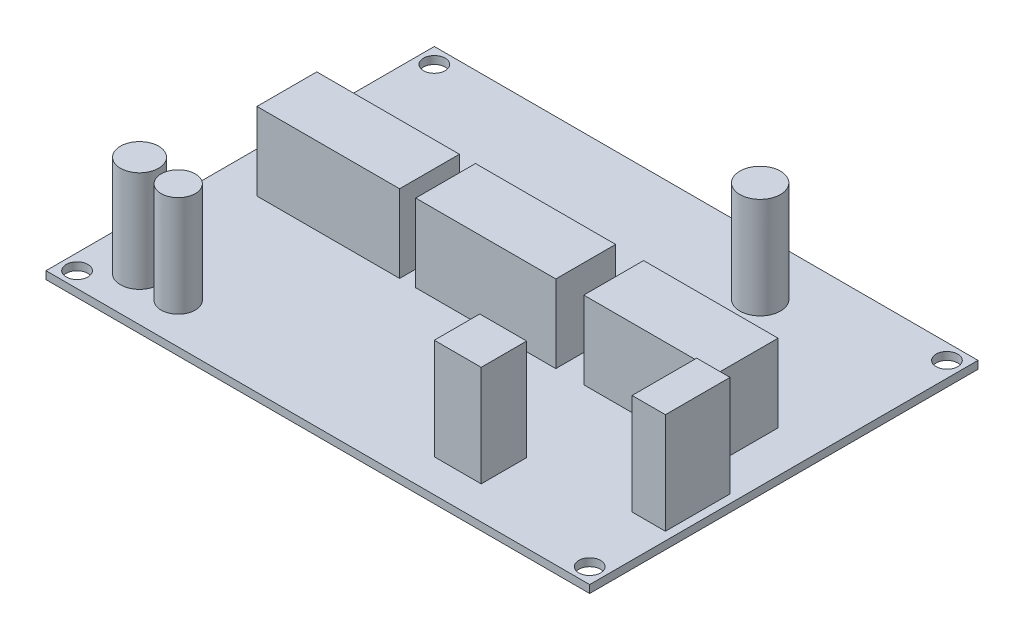
ISO-10303-21;
HEADER;
FILE_DESCRIPTION(('STEP AP214'),'2;1');
FILE_NAME('part.step','',(''),(''),'','','');
FILE_SCHEMA(('AUTOMOTIVE_DESIGN { 1 0 10303 214 1 1 1 1 }'));
ENDSEC;
DATA;
#1=APPLICATION_CONTEXT('core data for automotive mechanical design processes');
#2=APPLICATION_PROTOCOL_DEFINITION('international standard','automotive_design',2000,#1);
#3=PRODUCT_CONTEXT('',#1,'mechanical');
#4=PRODUCT('Part','Part','',(#3));
#5=PRODUCT_RELATED_PRODUCT_CATEGORY('part','',(#4));
#6=PRODUCT_DEFINITION_FORMATION('','',#4);
#7=PRODUCT_DEFINITION_CONTEXT('part definition',#1,'design');
#8=PRODUCT_DEFINITION('design','',#6,#7);
#9=PRODUCT_DEFINITION_SHAPE('','',#8);
#10=(LENGTH_UNIT() NAMED_UNIT(*) SI_UNIT(.MILLI.,.METRE.));
#11=(NAMED_UNIT(*) PLANE_ANGLE_UNIT() SI_UNIT($,.RADIAN.));
#12=(NAMED_UNIT(*) SI_UNIT($,.STERADIAN.) SOLID_ANGLE_UNIT());
#13=UNCERTAINTY_MEASURE_WITH_UNIT(LENGTH_MEASURE(1.E-05),#10,'distance_accuracy_value','');
#14=(GEOMETRIC_REPRESENTATION_CONTEXT(3) GLOBAL_UNCERTAINTY_ASSIGNED_CONTEXT((#13)) GLOBAL_UNIT_ASSIGNED_CONTEXT((#10,
#11,#12)) REPRESENTATION_CONTEXT('',''));
#15=CARTESIAN_POINT('',(0.,0.,0.));
#16=DIRECTION('',(0.,0.,1.));
#17=DIRECTION('',(1.,0.,0.));
#18=AXIS2_PLACEMENT_3D('',#15,#16,#17);
#19=CARTESIAN_POINT('',(0.,1.,0.));
#20=DIRECTION('',(0.,-1.,0.));
#21=DIRECTION('',(0.,0.,-1.));
#22=AXIS2_PLACEMENT_3D('',#19,#20,#21);
#23=PLANE('',#22);
#24=CARTESIAN_POINT('',(6.36727946623239,1.,-5.67661865059677));
#25=DIRECTION('',(0.,-1.,0.));
#26=DIRECTION('',(0.,0.,-1.));
#27=AXIS2_PLACEMENT_3D('',#24,#25,#26);
#28=CIRCLE('',#27,2.46146856132016);
#29=CARTESIAN_POINT('',(6.36727946623239,1.,-8.13808721191693));
#30=VERTEX_POINT('',#29);
#31=EDGE_CURVE('E11',#30,#30,#28,.F.);
#32=ORIENTED_EDGE('',*,*,#31,.F.);
#33=EDGE_LOOP('',(#32));
#34=FACE_BOUND('',#33,.T.);
#35=DIRECTION('',(0.,0.,1.));
#36=VECTOR('',#35,1.);
#37=CARTESIAN_POINT('',(45.7516822337425,1.,-4.24264186861123));
#38=LINE('',#37,#36);
#39=CARTESIAN_POINT('',(45.7516822337425,1.,-10.097866977997));
#40=VERTEX_POINT('',#39);
#41=CARTESIAN_POINT('',(45.7516822337425,1.,-4.24264186861123));
#42=VERTEX_POINT('',#41);
#43=EDGE_CURVE('E215',#40,#42,#38,.T.);
#44=ORIENTED_EDGE('',*,*,#43,.F.);
#45=DIRECTION('',(-1.,0.,0.));
#46=VECTOR('',#45,1.);
#47=CARTESIAN_POINT('',(45.7516822337425,1.,-10.097866977997));
#48=LINE('',#47,#46);
#49=CARTESIAN_POINT('',(51.7908402551996,1.,-10.097866977997));
#50=VERTEX_POINT('',#49);
#51=EDGE_CURVE('E228',#50,#40,#48,.T.);
#52=ORIENTED_EDGE('',*,*,#51,.F.);
#53=DIRECTION('',(0.,0.,-1.));
#54=VECTOR('',#53,1.);
#55=CARTESIAN_POINT('',(51.7908402551996,1.,-4.24264186861123));
#56=LINE('',#55,#54);
#57=CARTESIAN_POINT('',(51.7908402551996,1.,-4.24264186861123));
#58=VERTEX_POINT('',#57);
#59=EDGE_CURVE('E237',#58,#50,#56,.T.);
#60=ORIENTED_EDGE('',*,*,#59,.F.);
#61=DIRECTION('',(1.,0.,0.));
#62=VECTOR('',#61,1.);
#63=CARTESIAN_POINT('',(45.7516822337425,1.,-4.24264186861123));
#64=LINE('',#63,#62);
#65=EDGE_CURVE('E218',#42,#58,#64,.T.);
#66=ORIENTED_EDGE('',*,*,#65,.F.);
#67=EDGE_LOOP('',(#44,#52,#60,#66));
#68=FACE_BOUND('',#67,.T.);
#69=CARTESIAN_POINT('',(49.1775091770705,1.,-42.7745952635661));
#70=DIRECTION('',(0.,-1.,0.));
#71=DIRECTION('',(0.,0.,-1.));
#72=AXIS2_PLACEMENT_3D('',#69,#70,#71);
#73=CIRCLE('',#72,2.61333107812908);
#74=CARTESIAN_POINT('',(49.1775091770705,1.,-45.3879263416952));
#75=VERTEX_POINT('',#74);
#76=EDGE_CURVE('E41',#75,#75,#73,.F.);
#77=ORIENTED_EDGE('',*,*,#76,.F.);
#78=EDGE_LOOP('',(#77));
#79=FACE_BOUND('',#78,.T.);
#80=CARTESIAN_POINT('',(11.8124296488915,1.,-5.20728258898018));
#81=DIRECTION('',(0.,-1.,0.));
#82=DIRECTION('',(0.,0.,-1.));
#83=AXIS2_PLACEMENT_3D('',#80,#81,#82);
#84=CIRCLE('',#83,2.19939754507337);
#85=CARTESIAN_POINT('',(11.8124296488915,1.,-7.40668013405355));
#86=VERTEX_POINT('',#85);
#87=EDGE_CURVE('E412',#86,#86,#84,.F.);
#88=ORIENTED_EDGE('',*,*,#87,.F.);
#89=EDGE_LOOP('',(#88));
#90=FACE_BOUND('',#89,.T.);
#91=DIRECTION('',(0.,0.,1.));
#92=VECTOR('',#91,1.);
#93=CARTESIAN_POINT('',(25.7012497108633,1.,-21.8993989226632));
#94=LINE('',#93,#92);
#95=CARTESIAN_POINT('',(25.7012497108633,1.,-29.5999607452657));
#96=VERTEX_POINT('',#95);
#97=CARTESIAN_POINT('',(25.7012497108633,1.,-21.8993989226632));
#98=VERTEX_POINT('',#97);
#99=EDGE_CURVE('E292',#96,#98,#94,.T.);
#100=ORIENTED_EDGE('',*,*,#99,.F.);
#101=DIRECTION('',(-1.,0.,0.));
#102=VECTOR('',#101,1.);
#103=CARTESIAN_POINT('',(25.7012497108633,1.,-29.5999607452657));
#104=LINE('',#103,#102);
#105=CARTESIAN_POINT('',(43.7397057958719,1.,-29.5999607452657));
#106=VERTEX_POINT('',#105);
#107=EDGE_CURVE('E297',#106,#96,#104,.T.);
#108=ORIENTED_EDGE('',*,*,#107,.F.);
#109=DIRECTION('',(0.,0.,-1.));
#110=VECTOR('',#109,1.);
#111=CARTESIAN_POINT('',(43.7397057958719,1.,-21.8993989226632));
#112=LINE('',#111,#110);
#113=CARTESIAN_POINT('',(43.7397057958719,1.,-21.8993989226632));
#114=VERTEX_POINT('',#113);
#115=EDGE_CURVE('E309',#114,#106,#112,.T.);
#116=ORIENTED_EDGE('',*,*,#115,.F.);
#117=DIRECTION('',(1.,0.,0.));
#118=VECTOR('',#117,1.);
#119=CARTESIAN_POINT('',(25.7012497108633,1.,-21.8993989226632));
#120=LINE('',#119,#118);
#121=EDGE_CURVE('E306',#98,#114,#120,.T.);
#122=ORIENTED_EDGE('',*,*,#121,.F.);
#123=EDGE_LOOP('',(#100,#108,#116,#122));
#124=FACE_BOUND('',#123,.T.);
#125=DIRECTION('',(0.,0.,1.));
#126=VECTOR('',#125,1.);
#127=CARTESIAN_POINT('',(0.,1.,0.));
#128=LINE('',#127,#126);
#129=CARTESIAN_POINT('',(0.,1.,-50.));
#130=VERTEX_POINT('',#129);
#131=CARTESIAN_POINT('',(0.,1.,0.));
#132=VERTEX_POINT('',#131);
#133=EDGE_CURVE('E383',#130,#132,#128,.T.);
#134=ORIENTED_EDGE('',*,*,#133,.T.);
#135=DIRECTION('',(1.,0.,0.));
#136=VECTOR('',#135,1.);
#137=CARTESIAN_POINT('',(0.,1.,0.));
#138=LINE('',#137,#136);
#139=CARTESIAN_POINT('',(70.,1.,0.));
#140=VERTEX_POINT('',#139);
#141=EDGE_CURVE('E386',#132,#140,#138,.T.);
#142=ORIENTED_EDGE('',*,*,#141,.T.);
#143=DIRECTION('',(0.,0.,-1.));
#144=VECTOR('',#143,1.);
#145=CARTESIAN_POINT('',(70.,1.,0.));
#146=LINE('',#145,#144);
#147=CARTESIAN_POINT('',(70.,1.,-50.));
#148=VERTEX_POINT('',#147);
#149=EDGE_CURVE('E389',#140,#148,#146,.T.);
#150=ORIENTED_EDGE('',*,*,#149,.T.);
#151=DIRECTION('',(-1.,0.,0.));
#152=VECTOR('',#151,1.);
#153=CARTESIAN_POINT('',(0.,1.,-50.));
#154=LINE('',#153,#152);
#155=EDGE_CURVE('E391',#148,#130,#154,.T.);
#156=ORIENTED_EDGE('',*,*,#155,.T.);
#157=EDGE_LOOP('',(#134,#142,#150,#156));
#158=FACE_BOUND('',#157,.T.);
#159=CARTESIAN_POINT('',(2.00000000000002,1.,-48.));
#160=DIRECTION('',(0.,1.,0.));
#161=DIRECTION('',(0.,0.,1.));
#162=AXIS2_PLACEMENT_3D('',#159,#160,#161);
#163=CIRCLE('',#162,1.4);
#164=CARTESIAN_POINT('',(2.00000000000002,1.,-46.6));
#165=VERTEX_POINT('',#164);
#166=EDGE_CURVE('E362',#165,#165,#163,.T.);
#167=ORIENTED_EDGE('',*,*,#166,.F.);
#168=EDGE_LOOP('',(#167));
#169=FACE_BOUND('',#168,.T.);
#170=CARTESIAN_POINT('',(68.,1.,-48.));
#171=DIRECTION('',(0.,1.,0.));
#172=DIRECTION('',(0.,0.,1.));
#173=AXIS2_PLACEMENT_3D('',#170,#171,#172);
#174=CIRCLE('',#173,1.4);
#175=CARTESIAN_POINT('',(68.,1.,-46.6));
#176=VERTEX_POINT('',#175);
#177=EDGE_CURVE('E363',#176,#176,#174,.T.);
#178=ORIENTED_EDGE('',*,*,#177,.F.);
#179=EDGE_LOOP('',(#178));
#180=FACE_BOUND('',#179,.T.);
#181=CARTESIAN_POINT('',(68.,1.,-2.00000000000001));
#182=DIRECTION('',(0.,1.,0.));
#183=DIRECTION('',(0.,0.,1.));
#184=AXIS2_PLACEMENT_3D('',#181,#182,#183);
#185=CIRCLE('',#184,1.4);
#186=CARTESIAN_POINT('',(68.,1.,-0.600000000000006));
#187=VERTEX_POINT('',#186);
#188=EDGE_CURVE('E369',#187,#187,#185,.T.);
#189=ORIENTED_EDGE('',*,*,#188,.F.);
#190=EDGE_LOOP('',(#189));
#191=FACE_BOUND('',#190,.T.);
#192=CARTESIAN_POINT('',(2.00000000000001,1.,-2.00000000000001));
#193=DIRECTION('',(0.,1.,0.));
#194=DIRECTION('',(0.,0.,1.));
#195=AXIS2_PLACEMENT_3D('',#192,#193,#194);
#196=CIRCLE('',#195,1.4);
#197=CARTESIAN_POINT('',(2.00000000000001,1.,-0.600000000000009));
#198=VERTEX_POINT('',#197);
#199=EDGE_CURVE('E358',#198,#198,#196,.T.);
#200=ORIENTED_EDGE('',*,*,#199,.F.);
#201=EDGE_LOOP('',(#200));
#202=FACE_BOUND('',#201,.T.);
#203=DIRECTION('',(0.,0.,1.));
#204=VECTOR('',#203,1.);
#205=CARTESIAN_POINT('',(5.26435120326596,1.,-21.8993989226632));
#206=LINE('',#205,#204);
#207=CARTESIAN_POINT('',(5.26435120326596,1.,-29.5999607452657));
#208=VERTEX_POINT('',#207);
#209=CARTESIAN_POINT('',(5.26435120326596,1.,-21.8993989226632));
#210=VERTEX_POINT('',#209);
#211=EDGE_CURVE('E325',#208,#210,#206,.T.);
#212=ORIENTED_EDGE('',*,*,#211,.F.);
#213=DIRECTION('',(-1.,0.,0.));
#214=VECTOR('',#213,1.);
#215=CARTESIAN_POINT('',(5.26435120326596,1.,-29.5999607452657));
#216=LINE('',#215,#214);
#217=CARTESIAN_POINT('',(23.6300542942445,1.,-29.5999607452657));
#218=VERTEX_POINT('',#217);
#219=EDGE_CURVE('E330',#218,#208,#216,.T.);
#220=ORIENTED_EDGE('',*,*,#219,.F.);
#221=DIRECTION('',(0.,0.,-1.));
#222=VECTOR('',#221,1.);
#223=CARTESIAN_POINT('',(23.6300542942445,1.,-21.8993989226632));
#224=LINE('',#223,#222);
#225=CARTESIAN_POINT('',(23.6300542942445,1.,-21.8993989226632));
#226=VERTEX_POINT('',#225);
#227=EDGE_CURVE('E342',#226,#218,#224,.T.);
#228=ORIENTED_EDGE('',*,*,#227,.F.);
#229=DIRECTION('',(1.,0.,0.));
#230=VECTOR('',#229,1.);
#231=CARTESIAN_POINT('',(5.26435120326596,1.,-21.8993989226632));
#232=LINE('',#231,#230);
#233=EDGE_CURVE('E339',#210,#226,#232,.T.);
#234=ORIENTED_EDGE('',*,*,#233,.F.);
#235=EDGE_LOOP('',(#212,#220,#228,#234));
#236=FACE_BOUND('',#235,.T.);
#237=DIRECTION('',(0.,0.,1.));
#238=VECTOR('',#237,1.);
#239=CARTESIAN_POINT('',(47.3437497293787,1.,-21.8993989226632));
#240=LINE('',#239,#238);
#241=CARTESIAN_POINT('',(47.3437497293787,1.,-29.5999607452657));
#242=VERTEX_POINT('',#241);
#243=CARTESIAN_POINT('',(47.3437497293787,1.,-21.8993989226632));
#244=VERTEX_POINT('',#243);
#245=EDGE_CURVE('E259',#242,#244,#240,.T.);
#246=ORIENTED_EDGE('',*,*,#245,.F.);
#247=DIRECTION('',(-1.,0.,0.));
#248=VECTOR('',#247,1.);
#249=CARTESIAN_POINT('',(47.3437497293787,1.,-29.5999607452657));
#250=LINE('',#249,#248);
#251=CARTESIAN_POINT('',(64.6577057434001,1.,-29.5999607452657));
#252=VERTEX_POINT('',#251);
#253=EDGE_CURVE('E264',#252,#242,#250,.T.);
#254=ORIENTED_EDGE('',*,*,#253,.F.);
#255=DIRECTION('',(0.,0.,-1.));
#256=VECTOR('',#255,1.);
#257=CARTESIAN_POINT('',(64.6577057434001,1.,-21.8993989226632));
#258=LINE('',#257,#256);
#259=CARTESIAN_POINT('',(64.6577057434001,1.,-21.8993989226632));
#260=VERTEX_POINT('',#259);
#261=EDGE_CURVE('E276',#260,#252,#258,.T.);
#262=ORIENTED_EDGE('',*,*,#261,.F.);
#263=DIRECTION('',(1.,0.,0.));
#264=VECTOR('',#263,1.);
#265=CARTESIAN_POINT('',(47.3437497293787,1.,-21.8993989226632));
#266=LINE('',#265,#264);
#267=EDGE_CURVE('E273',#244,#260,#266,.T.);
#268=ORIENTED_EDGE('',*,*,#267,.F.);
#269=EDGE_LOOP('',(#246,#254,#262,#268));
#270=FACE_BOUND('',#269,.T.);
#271=DIRECTION('',(0.,0.,-1.));
#272=VECTOR('',#271,1.);
#273=CARTESIAN_POINT('',(68.9340442963626,1.,-10.8187442746299));
#274=LINE('',#273,#272);
#275=CARTESIAN_POINT('',(68.9340442963626,1.,-10.8187442746299));
#276=VERTEX_POINT('',#275);
#277=CARTESIAN_POINT('',(68.9340442963626,1.,-19.1394672708221));
#278=VERTEX_POINT('',#277);
#279=EDGE_CURVE('E214',#276,#278,#274,.T.);
#280=ORIENTED_EDGE('',*,*,#279,.F.);
#281=DIRECTION('',(1.,0.,0.));
#282=VECTOR('',#281,1.);
#283=CARTESIAN_POINT('',(68.9340442963626,1.,-10.8187442746299));
#284=LINE('',#283,#282);
#285=CARTESIAN_POINT('',(64.6456574352001,1.,-10.8187442746299));
#286=VERTEX_POINT('',#285);
#287=EDGE_CURVE('E211',#286,#276,#284,.T.);
#288=ORIENTED_EDGE('',*,*,#287,.F.);
#289=DIRECTION('',(0.,0.,1.));
#290=VECTOR('',#289,1.);
#291=CARTESIAN_POINT('',(64.6456574352001,1.,-10.8187442746299));
#292=LINE('',#291,#290);
#293=CARTESIAN_POINT('',(64.6456574352001,1.,-19.1394672708221));
#294=VERTEX_POINT('',#293);
#295=EDGE_CURVE('E53',#294,#286,#292,.T.);
#296=ORIENTED_EDGE('',*,*,#295,.F.);
#297=DIRECTION('',(-1.,0.,0.));
#298=VECTOR('',#297,1.);
#299=CARTESIAN_POINT('',(68.9340442963626,1.,-19.1394672708221));
#300=LINE('',#299,#298);
#301=EDGE_CURVE('E48',#278,#294,#300,.T.);
#302=ORIENTED_EDGE('',*,*,#301,.F.);
#303=EDGE_LOOP('',(#280,#288,#296,#302));
#304=FACE_BOUND('',#303,.T.);
#305=ADVANCED_FACE('F33',(#34,#68,#79,#90,#124,#158,#169,#180,#191,#202,#236,#270,#304),#23,.F.);
#306=CARTESIAN_POINT('',(0.,1.,0.));
#307=DIRECTION('',(1.,0.,0.));
#308=DIRECTION('',(0.,0.,-1.));
#309=AXIS2_PLACEMENT_3D('',#306,#307,#308);
#310=PLANE('',#309);
#311=DIRECTION('',(0.,0.,1.));
#312=VECTOR('',#311,1.);
#313=CARTESIAN_POINT('',(0.,0.,0.));
#314=LINE('',#313,#312);
#315=CARTESIAN_POINT('',(0.,0.,-50.));
#316=VERTEX_POINT('',#315);
#317=CARTESIAN_POINT('',(0.,0.,0.));
#318=VERTEX_POINT('',#317);
#319=EDGE_CURVE('E380',#316,#318,#314,.T.);
#320=ORIENTED_EDGE('',*,*,#319,.T.);
#321=DIRECTION('',(0.,-1.,0.));
#322=VECTOR('',#321,1.);
#323=CARTESIAN_POINT('',(0.,1.,0.));
#324=LINE('',#323,#322);
#325=EDGE_CURVE('E409',#132,#318,#324,.T.);
#326=ORIENTED_EDGE('',*,*,#325,.F.);
#327=ORIENTED_EDGE('',*,*,#133,.F.);
#328=DIRECTION('',(0.,-1.,0.));
#329=VECTOR('',#328,1.);
#330=CARTESIAN_POINT('',(0.,1.,-50.));
#331=LINE('',#330,#329);
#332=EDGE_CURVE('E393',#130,#316,#331,.T.);
#333=ORIENTED_EDGE('',*,*,#332,.T.);
#334=EDGE_LOOP('',(#320,#326,#327,#333));
#335=FACE_BOUND('',#334,.T.);
#336=ADVANCED_FACE('F35',(#335),#310,.F.);
#337=CARTESIAN_POINT('',(0.,1.,0.));
#338=DIRECTION('',(0.,0.,-1.));
#339=DIRECTION('',(-1.,0.,0.));
#340=AXIS2_PLACEMENT_3D('',#337,#338,#339);
#341=PLANE('',#340);
#342=DIRECTION('',(1.,0.,0.));
#343=VECTOR('',#342,1.);
#344=CARTESIAN_POINT('',(0.,0.,0.));
#345=LINE('',#344,#343);
#346=CARTESIAN_POINT('',(70.,0.,0.));
#347=VERTEX_POINT('',#346);
#348=EDGE_CURVE('E396',#318,#347,#345,.T.);
#349=ORIENTED_EDGE('',*,*,#348,.T.);
#350=DIRECTION('',(0.,-1.,0.));
#351=VECTOR('',#350,1.);
#352=CARTESIAN_POINT('',(70.,1.,0.));
#353=LINE('',#352,#351);
#354=EDGE_CURVE('E406',#140,#347,#353,.T.);
#355=ORIENTED_EDGE('',*,*,#354,.F.);
#356=ORIENTED_EDGE('',*,*,#141,.F.);
#357=ORIENTED_EDGE('',*,*,#325,.T.);
#358=EDGE_LOOP('',(#349,#355,#356,#357));
#359=FACE_BOUND('',#358,.T.);
#360=ADVANCED_FACE('F592',(#359),#341,.F.);
#361=CARTESIAN_POINT('',(70.,1.,0.));
#362=DIRECTION('',(-1.,0.,0.));
#363=DIRECTION('',(0.,0.,1.));
#364=AXIS2_PLACEMENT_3D('',#361,#362,#363);
#365=PLANE('',#364);
#366=DIRECTION('',(0.,0.,-1.));
#367=VECTOR('',#366,1.);
#368=CARTESIAN_POINT('',(70.,0.,0.));
#369=LINE('',#368,#367);
#370=CARTESIAN_POINT('',(70.,0.,-50.));
#371=VERTEX_POINT('',#370);
#372=EDGE_CURVE('E398',#347,#371,#369,.T.);
#373=ORIENTED_EDGE('',*,*,#372,.T.);
#374=DIRECTION('',(0.,-1.,0.));
#375=VECTOR('',#374,1.);
#376=CARTESIAN_POINT('',(70.,1.,-50.));
#377=LINE('',#376,#375);
#378=EDGE_CURVE('E403',#148,#371,#377,.T.);
#379=ORIENTED_EDGE('',*,*,#378,.F.);
#380=ORIENTED_EDGE('',*,*,#149,.F.);
#381=ORIENTED_EDGE('',*,*,#354,.T.);
#382=EDGE_LOOP('',(#373,#379,#380,#381));
#383=FACE_BOUND('',#382,.T.);
#384=ADVANCED_FACE('F589',(#383),#365,.F.);
#385=CARTESIAN_POINT('',(0.,1.,-50.));
#386=DIRECTION('',(0.,0.,1.));
#387=DIRECTION('',(1.,0.,0.));
#388=AXIS2_PLACEMENT_3D('',#385,#386,#387);
#389=PLANE('',#388);
#390=DIRECTION('',(-1.,0.,0.));
#391=VECTOR('',#390,1.);
#392=CARTESIAN_POINT('',(0.,0.,-50.));
#393=LINE('',#392,#391);
#394=EDGE_CURVE('E387',#371,#316,#393,.T.);
#395=ORIENTED_EDGE('',*,*,#394,.T.);
#396=ORIENTED_EDGE('',*,*,#332,.F.);
#397=ORIENTED_EDGE('',*,*,#155,.F.);
#398=ORIENTED_EDGE('',*,*,#378,.T.);
#399=EDGE_LOOP('',(#395,#396,#397,#398));
#400=FACE_BOUND('',#399,.T.);
#401=ADVANCED_FACE('F585',(#400),#389,.F.);
#402=CARTESIAN_POINT('',(0.,0.,0.));
#403=DIRECTION('',(0.,-1.,0.));
#404=DIRECTION('',(0.,0.,-1.));
#405=AXIS2_PLACEMENT_3D('',#402,#403,#404);
#406=PLANE('',#405);
#407=CARTESIAN_POINT('',(2.00000000000001,0.,-2.00000000000001));
#408=DIRECTION('',(0.,1.,0.));
#409=DIRECTION('',(0.,0.,1.));
#410=AXIS2_PLACEMENT_3D('',#407,#408,#409);
#411=CIRCLE('',#410,1.4);
#412=CARTESIAN_POINT('',(2.00000000000001,0.,-0.600000000000009));
#413=VERTEX_POINT('',#412);
#414=EDGE_CURVE('E372',#413,#413,#411,.T.);
#415=ORIENTED_EDGE('',*,*,#414,.T.);
#416=EDGE_LOOP('',(#415));
#417=FACE_BOUND('',#416,.T.);
#418=CARTESIAN_POINT('',(68.,0.,-2.00000000000001));
#419=DIRECTION('',(0.,1.,0.));
#420=DIRECTION('',(0.,0.,1.));
#421=AXIS2_PLACEMENT_3D('',#418,#419,#420);
#422=CIRCLE('',#421,1.4);
#423=CARTESIAN_POINT('',(68.,0.,-0.600000000000006));
#424=VERTEX_POINT('',#423);
#425=EDGE_CURVE('E366',#424,#424,#422,.T.);
#426=ORIENTED_EDGE('',*,*,#425,.T.);
#427=EDGE_LOOP('',(#426));
#428=FACE_BOUND('',#427,.T.);
#429=CARTESIAN_POINT('',(68.,0.,-48.));
#430=DIRECTION('',(0.,1.,0.));
#431=DIRECTION('',(0.,0.,1.));
#432=AXIS2_PLACEMENT_3D('',#429,#430,#431);
#433=CIRCLE('',#432,1.4);
#434=CARTESIAN_POINT('',(68.,0.,-46.6));
#435=VERTEX_POINT('',#434);
#436=EDGE_CURVE('E359',#435,#435,#433,.T.);
#437=ORIENTED_EDGE('',*,*,#436,.T.);
#438=EDGE_LOOP('',(#437));
#439=FACE_BOUND('',#438,.T.);
#440=CARTESIAN_POINT('',(2.00000000000002,0.,-48.));
#441=DIRECTION('',(0.,1.,0.));
#442=DIRECTION('',(0.,0.,1.));
#443=AXIS2_PLACEMENT_3D('',#440,#441,#442);
#444=CIRCLE('',#443,1.4);
#445=CARTESIAN_POINT('',(2.00000000000002,0.,-46.6));
#446=VERTEX_POINT('',#445);
#447=EDGE_CURVE('E377',#446,#446,#444,.T.);
#448=ORIENTED_EDGE('',*,*,#447,.T.);
#449=EDGE_LOOP('',(#448));
#450=FACE_BOUND('',#449,.T.);
#451=ORIENTED_EDGE('',*,*,#319,.F.);
#452=ORIENTED_EDGE('',*,*,#394,.F.);
#453=ORIENTED_EDGE('',*,*,#372,.F.);
#454=ORIENTED_EDGE('',*,*,#348,.F.);
#455=EDGE_LOOP('',(#451,#452,#453,#454));
#456=FACE_BOUND('',#455,.T.);
#457=ADVANCED_FACE('F580',(#417,#428,#439,#450,#456),#406,.T.);
#458=CARTESIAN_POINT('',(2.00000000000002,0.,-48.));
#459=DIRECTION('',(0.,1.,0.));
#460=DIRECTION('',(0.,0.,1.));
#461=AXIS2_PLACEMENT_3D('',#458,#459,#460);
#462=CYLINDRICAL_SURFACE('',#461,1.4);
#463=ORIENTED_EDGE('',*,*,#447,.F.);
#464=EDGE_LOOP('',(#463));
#465=FACE_BOUND('',#464,.T.);
#466=ORIENTED_EDGE('',*,*,#166,.T.);
#467=EDGE_LOOP('',(#466));
#468=FACE_BOUND('',#467,.T.);
#469=ADVANCED_FACE('F571',(#465,#468),#462,.F.);
#470=CARTESIAN_POINT('',(68.,0.,-48.));
#471=DIRECTION('',(0.,1.,0.));
#472=DIRECTION('',(0.,0.,1.));
#473=AXIS2_PLACEMENT_3D('',#470,#471,#472);
#474=CYLINDRICAL_SURFACE('',#473,1.4);
#475=ORIENTED_EDGE('',*,*,#436,.F.);
#476=EDGE_LOOP('',(#475));
#477=FACE_BOUND('',#476,.T.);
#478=ORIENTED_EDGE('',*,*,#177,.T.);
#479=EDGE_LOOP('',(#478));
#480=FACE_BOUND('',#479,.T.);
#481=ADVANCED_FACE('F567',(#477,#480),#474,.F.);
#482=CARTESIAN_POINT('',(68.,0.,-2.00000000000001));
#483=DIRECTION('',(0.,1.,0.));
#484=DIRECTION('',(0.,0.,1.));
#485=AXIS2_PLACEMENT_3D('',#482,#483,#484);
#486=CYLINDRICAL_SURFACE('',#485,1.4);
#487=ORIENTED_EDGE('',*,*,#425,.F.);
#488=EDGE_LOOP('',(#487));
#489=FACE_BOUND('',#488,.T.);
#490=ORIENTED_EDGE('',*,*,#188,.T.);
#491=EDGE_LOOP('',(#490));
#492=FACE_BOUND('',#491,.T.);
#493=ADVANCED_FACE('F570',(#489,#492),#486,.F.);
#494=CARTESIAN_POINT('',(2.00000000000001,0.,-2.00000000000001));
#495=DIRECTION('',(0.,1.,0.));
#496=DIRECTION('',(0.,0.,1.));
#497=AXIS2_PLACEMENT_3D('',#494,#495,#496);
#498=CYLINDRICAL_SURFACE('',#497,1.4);
#499=ORIENTED_EDGE('',*,*,#414,.F.);
#500=EDGE_LOOP('',(#499));
#501=FACE_BOUND('',#500,.T.);
#502=ORIENTED_EDGE('',*,*,#199,.T.);
#503=EDGE_LOOP('',(#502));
#504=FACE_BOUND('',#503,.T.);
#505=ADVANCED_FACE('F565',(#501,#504),#498,.F.);
#506=CARTESIAN_POINT('',(5.26435120326596,11.,-21.8993989226632));
#507=DIRECTION('',(1.,0.,0.));
#508=DIRECTION('',(0.,0.,-1.));
#509=AXIS2_PLACEMENT_3D('',#506,#507,#508);
#510=PLANE('',#509);
#511=ORIENTED_EDGE('',*,*,#211,.T.);
#512=DIRECTION('',(0.,-1.,0.));
#513=VECTOR('',#512,1.);
#514=CARTESIAN_POINT('',(5.26435120326596,11.,-21.8993989226632));
#515=LINE('',#514,#513);
#516=CARTESIAN_POINT('',(5.26435120326596,11.,-21.8993989226632));
#517=VERTEX_POINT('',#516);
#518=EDGE_CURVE('E355',#517,#210,#515,.T.);
#519=ORIENTED_EDGE('',*,*,#518,.F.);
#520=DIRECTION('',(0.,0.,1.));
#521=VECTOR('',#520,1.);
#522=CARTESIAN_POINT('',(5.26435120326596,11.,-21.8993989226632));
#523=LINE('',#522,#521);
#524=CARTESIAN_POINT('',(5.26435120326596,11.,-29.5999607452657));
#525=VERTEX_POINT('',#524);
#526=EDGE_CURVE('E326',#525,#517,#523,.T.);
#527=ORIENTED_EDGE('',*,*,#526,.F.);
#528=DIRECTION('',(0.,-1.,0.));
#529=VECTOR('',#528,1.);
#530=CARTESIAN_POINT('',(5.26435120326596,11.,-29.5999607452657));
#531=LINE('',#530,#529);
#532=EDGE_CURVE('E336',#525,#208,#531,.T.);
#533=ORIENTED_EDGE('',*,*,#532,.T.);
#534=EDGE_LOOP('',(#511,#519,#527,#533));
#535=FACE_BOUND('',#534,.T.);
#536=ADVANCED_FACE('F561',(#535),#510,.F.);
#537=CARTESIAN_POINT('',(5.26435120326596,11.,-21.8993989226632));
#538=DIRECTION('',(0.,0.,-1.));
#539=DIRECTION('',(-1.,0.,0.));
#540=AXIS2_PLACEMENT_3D('',#537,#538,#539);
#541=PLANE('',#540);
#542=ORIENTED_EDGE('',*,*,#233,.T.);
#543=DIRECTION('',(0.,-1.,0.));
#544=VECTOR('',#543,1.);
#545=CARTESIAN_POINT('',(23.6300542942445,11.,-21.8993989226632));
#546=LINE('',#545,#544);
#547=CARTESIAN_POINT('',(23.6300542942445,11.,-21.8993989226632));
#548=VERTEX_POINT('',#547);
#549=EDGE_CURVE('E352',#548,#226,#546,.T.);
#550=ORIENTED_EDGE('',*,*,#549,.F.);
#551=DIRECTION('',(1.,0.,0.));
#552=VECTOR('',#551,1.);
#553=CARTESIAN_POINT('',(5.26435120326596,11.,-21.8993989226632));
#554=LINE('',#553,#552);
#555=EDGE_CURVE('E329',#517,#548,#554,.T.);
#556=ORIENTED_EDGE('',*,*,#555,.F.);
#557=ORIENTED_EDGE('',*,*,#518,.T.);
#558=EDGE_LOOP('',(#542,#550,#556,#557));
#559=FACE_BOUND('',#558,.T.);
#560=ADVANCED_FACE('F557',(#559),#541,.F.);
#561=CARTESIAN_POINT('',(23.6300542942445,11.,-21.8993989226632));
#562=DIRECTION('',(-1.,0.,0.));
#563=DIRECTION('',(0.,0.,1.));
#564=AXIS2_PLACEMENT_3D('',#561,#562,#563);
#565=PLANE('',#564);
#566=ORIENTED_EDGE('',*,*,#227,.T.);
#567=DIRECTION('',(0.,-1.,0.));
#568=VECTOR('',#567,1.);
#569=CARTESIAN_POINT('',(23.6300542942445,11.,-29.5999607452657));
#570=LINE('',#569,#568);
#571=CARTESIAN_POINT('',(23.6300542942445,11.,-29.5999607452657));
#572=VERTEX_POINT('',#571);
#573=EDGE_CURVE('E349',#572,#218,#570,.T.);
#574=ORIENTED_EDGE('',*,*,#573,.F.);
#575=DIRECTION('',(0.,0.,-1.));
#576=VECTOR('',#575,1.);
#577=CARTESIAN_POINT('',(23.6300542942445,11.,-21.8993989226632));
#578=LINE('',#577,#576);
#579=EDGE_CURVE('E332',#548,#572,#578,.T.);
#580=ORIENTED_EDGE('',*,*,#579,.F.);
#581=ORIENTED_EDGE('',*,*,#549,.T.);
#582=EDGE_LOOP('',(#566,#574,#580,#581));
#583=FACE_BOUND('',#582,.T.);
#584=ADVANCED_FACE('F553',(#583),#565,.F.);
#585=CARTESIAN_POINT('',(5.26435120326596,11.,-29.5999607452657));
#586=DIRECTION('',(0.,0.,1.));
#587=DIRECTION('',(1.,0.,0.));
#588=AXIS2_PLACEMENT_3D('',#585,#586,#587);
#589=PLANE('',#588);
#590=ORIENTED_EDGE('',*,*,#219,.T.);
#591=ORIENTED_EDGE('',*,*,#532,.F.);
#592=DIRECTION('',(-1.,0.,0.));
#593=VECTOR('',#592,1.);
#594=CARTESIAN_POINT('',(5.26435120326596,11.,-29.5999607452657));
#595=LINE('',#594,#593);
#596=EDGE_CURVE('E334',#572,#525,#595,.T.);
#597=ORIENTED_EDGE('',*,*,#596,.F.);
#598=ORIENTED_EDGE('',*,*,#573,.T.);
#599=EDGE_LOOP('',(#590,#591,#597,#598));
#600=FACE_BOUND('',#599,.T.);
#601=ADVANCED_FACE('F549',(#600),#589,.F.);
#602=CARTESIAN_POINT('',(0.,11.,0.));
#603=DIRECTION('',(0.,-1.,0.));
#604=DIRECTION('',(0.,0.,-1.));
#605=AXIS2_PLACEMENT_3D('',#602,#603,#604);
#606=PLANE('',#605);
#607=ORIENTED_EDGE('',*,*,#526,.T.);
#608=ORIENTED_EDGE('',*,*,#555,.T.);
#609=ORIENTED_EDGE('',*,*,#579,.T.);
#610=ORIENTED_EDGE('',*,*,#596,.T.);
#611=EDGE_LOOP('',(#607,#608,#609,#610));
#612=FACE_BOUND('',#611,.T.);
#613=ADVANCED_FACE('F545',(#612),#606,.F.);
#614=CARTESIAN_POINT('',(25.7012497108633,11.,-21.8993989226632));
#615=DIRECTION('',(1.,0.,0.));
#616=DIRECTION('',(0.,0.,-1.));
#617=AXIS2_PLACEMENT_3D('',#614,#615,#616);
#618=PLANE('',#617);
#619=ORIENTED_EDGE('',*,*,#99,.T.);
#620=DIRECTION('',(0.,-1.,0.));
#621=VECTOR('',#620,1.);
#622=CARTESIAN_POINT('',(25.7012497108633,11.,-21.8993989226632));
#623=LINE('',#622,#621);
#624=CARTESIAN_POINT('',(25.7012497108633,11.,-21.8993989226632));
#625=VERTEX_POINT('',#624);
#626=EDGE_CURVE('E322',#625,#98,#623,.T.);
#627=ORIENTED_EDGE('',*,*,#626,.F.);
#628=DIRECTION('',(0.,0.,1.));
#629=VECTOR('',#628,1.);
#630=CARTESIAN_POINT('',(25.7012497108633,11.,-21.8993989226632));
#631=LINE('',#630,#629);
#632=CARTESIAN_POINT('',(25.7012497108633,11.,-29.5999607452657));
#633=VERTEX_POINT('',#632);
#634=EDGE_CURVE('E293',#633,#625,#631,.T.);
#635=ORIENTED_EDGE('',*,*,#634,.F.);
#636=DIRECTION('',(0.,-1.,0.));
#637=VECTOR('',#636,1.);
#638=CARTESIAN_POINT('',(25.7012497108633,11.,-29.5999607452657));
#639=LINE('',#638,#637);
#640=EDGE_CURVE('E303',#633,#96,#639,.T.);
#641=ORIENTED_EDGE('',*,*,#640,.T.);
#642=EDGE_LOOP('',(#619,#627,#635,#641));
#643=FACE_BOUND('',#642,.T.);
#644=ADVANCED_FACE('F541',(#643),#618,.F.);
#645=CARTESIAN_POINT('',(25.7012497108633,11.,-21.8993989226632));
#646=DIRECTION('',(0.,0.,-1.));
#647=DIRECTION('',(-1.,0.,0.));
#648=AXIS2_PLACEMENT_3D('',#645,#646,#647);
#649=PLANE('',#648);
#650=ORIENTED_EDGE('',*,*,#121,.T.);
#651=DIRECTION('',(0.,-1.,0.));
#652=VECTOR('',#651,1.);
#653=CARTESIAN_POINT('',(43.7397057958719,11.,-21.8993989226632));
#654=LINE('',#653,#652);
#655=CARTESIAN_POINT('',(43.7397057958719,11.,-21.8993989226632));
#656=VERTEX_POINT('',#655);
#657=EDGE_CURVE('E319',#656,#114,#654,.T.);
#658=ORIENTED_EDGE('',*,*,#657,.F.);
#659=DIRECTION('',(1.,0.,0.));
#660=VECTOR('',#659,1.);
#661=CARTESIAN_POINT('',(25.7012497108633,11.,-21.8993989226632));
#662=LINE('',#661,#660);
#663=EDGE_CURVE('E296',#625,#656,#662,.T.);
#664=ORIENTED_EDGE('',*,*,#663,.F.);
#665=ORIENTED_EDGE('',*,*,#626,.T.);
#666=EDGE_LOOP('',(#650,#658,#664,#665));
#667=FACE_BOUND('',#666,.T.);
#668=ADVANCED_FACE('F537',(#667),#649,.F.);
#669=CARTESIAN_POINT('',(43.7397057958719,11.,-21.8993989226632));
#670=DIRECTION('',(-1.,0.,0.));
#671=DIRECTION('',(0.,0.,1.));
#672=AXIS2_PLACEMENT_3D('',#669,#670,#671);
#673=PLANE('',#672);
#674=ORIENTED_EDGE('',*,*,#115,.T.);
#675=DIRECTION('',(0.,-1.,0.));
#676=VECTOR('',#675,1.);
#677=CARTESIAN_POINT('',(43.7397057958719,11.,-29.5999607452657));
#678=LINE('',#677,#676);
#679=CARTESIAN_POINT('',(43.7397057958719,11.,-29.5999607452657));
#680=VERTEX_POINT('',#679);
#681=EDGE_CURVE('E316',#680,#106,#678,.T.);
#682=ORIENTED_EDGE('',*,*,#681,.F.);
#683=DIRECTION('',(0.,0.,-1.));
#684=VECTOR('',#683,1.);
#685=CARTESIAN_POINT('',(43.7397057958719,11.,-21.8993989226632));
#686=LINE('',#685,#684);
#687=EDGE_CURVE('E299',#656,#680,#686,.T.);
#688=ORIENTED_EDGE('',*,*,#687,.F.);
#689=ORIENTED_EDGE('',*,*,#657,.T.);
#690=EDGE_LOOP('',(#674,#682,#688,#689));
#691=FACE_BOUND('',#690,.T.);
#692=ADVANCED_FACE('F533',(#691),#673,.F.);
#693=CARTESIAN_POINT('',(25.7012497108633,11.,-29.5999607452657));
#694=DIRECTION('',(0.,0.,1.));
#695=DIRECTION('',(1.,0.,0.));
#696=AXIS2_PLACEMENT_3D('',#693,#694,#695);
#697=PLANE('',#696);
#698=ORIENTED_EDGE('',*,*,#107,.T.);
#699=ORIENTED_EDGE('',*,*,#640,.F.);
#700=DIRECTION('',(-1.,0.,0.));
#701=VECTOR('',#700,1.);
#702=CARTESIAN_POINT('',(25.7012497108633,11.,-29.5999607452657));
#703=LINE('',#702,#701);
#704=EDGE_CURVE('E301',#680,#633,#703,.T.);
#705=ORIENTED_EDGE('',*,*,#704,.F.);
#706=ORIENTED_EDGE('',*,*,#681,.T.);
#707=EDGE_LOOP('',(#698,#699,#705,#706));
#708=FACE_BOUND('',#707,.T.);
#709=ADVANCED_FACE('F529',(#708),#697,.F.);
#710=CARTESIAN_POINT('',(0.,11.,0.));
#711=DIRECTION('',(0.,-1.,0.));
#712=DIRECTION('',(0.,0.,-1.));
#713=AXIS2_PLACEMENT_3D('',#710,#711,#712);
#714=PLANE('',#713);
#715=ORIENTED_EDGE('',*,*,#634,.T.);
#716=ORIENTED_EDGE('',*,*,#663,.T.);
#717=ORIENTED_EDGE('',*,*,#687,.T.);
#718=ORIENTED_EDGE('',*,*,#704,.T.);
#719=EDGE_LOOP('',(#715,#716,#717,#718));
#720=FACE_BOUND('',#719,.T.);
#721=ADVANCED_FACE('F525',(#720),#714,.F.);
#722=CARTESIAN_POINT('',(47.3437497293787,11.,-21.8993989226632));
#723=DIRECTION('',(1.,0.,0.));
#724=DIRECTION('',(0.,0.,-1.));
#725=AXIS2_PLACEMENT_3D('',#722,#723,#724);
#726=PLANE('',#725);
#727=ORIENTED_EDGE('',*,*,#245,.T.);
#728=DIRECTION('',(0.,-1.,0.));
#729=VECTOR('',#728,1.);
#730=CARTESIAN_POINT('',(47.3437497293787,11.,-21.8993989226632));
#731=LINE('',#730,#729);
#732=CARTESIAN_POINT('',(47.3437497293787,11.,-21.8993989226632));
#733=VERTEX_POINT('',#732);
#734=EDGE_CURVE('E289',#733,#244,#731,.T.);
#735=ORIENTED_EDGE('',*,*,#734,.F.);
#736=DIRECTION('',(0.,0.,1.));
#737=VECTOR('',#736,1.);
#738=CARTESIAN_POINT('',(47.3437497293787,11.,-21.8993989226632));
#739=LINE('',#738,#737);
#740=CARTESIAN_POINT('',(47.3437497293787,11.,-29.5999607452657));
#741=VERTEX_POINT('',#740);
#742=EDGE_CURVE('E260',#741,#733,#739,.T.);
#743=ORIENTED_EDGE('',*,*,#742,.F.);
#744=DIRECTION('',(0.,-1.,0.));
#745=VECTOR('',#744,1.);
#746=CARTESIAN_POINT('',(47.3437497293787,11.,-29.5999607452657));
#747=LINE('',#746,#745);
#748=EDGE_CURVE('E270',#741,#242,#747,.T.);
#749=ORIENTED_EDGE('',*,*,#748,.T.);
#750=EDGE_LOOP('',(#727,#735,#743,#749));
#751=FACE_BOUND('',#750,.T.);
#752=ADVANCED_FACE('F521',(#751),#726,.F.);
#753=CARTESIAN_POINT('',(47.3437497293787,11.,-21.8993989226632));
#754=DIRECTION('',(0.,0.,-1.));
#755=DIRECTION('',(-1.,0.,0.));
#756=AXIS2_PLACEMENT_3D('',#753,#754,#755);
#757=PLANE('',#756);
#758=ORIENTED_EDGE('',*,*,#267,.T.);
#759=DIRECTION('',(0.,-1.,0.));
#760=VECTOR('',#759,1.);
#761=CARTESIAN_POINT('',(64.6577057434001,11.,-21.8993989226632));
#762=LINE('',#761,#760);
#763=CARTESIAN_POINT('',(64.6577057434001,11.,-21.8993989226632));
#764=VERTEX_POINT('',#763);
#765=EDGE_CURVE('E286',#764,#260,#762,.T.);
#766=ORIENTED_EDGE('',*,*,#765,.F.);
#767=DIRECTION('',(1.,0.,0.));
#768=VECTOR('',#767,1.);
#769=CARTESIAN_POINT('',(47.3437497293787,11.,-21.8993989226632));
#770=LINE('',#769,#768);
#771=EDGE_CURVE('E263',#733,#764,#770,.T.);
#772=ORIENTED_EDGE('',*,*,#771,.F.);
#773=ORIENTED_EDGE('',*,*,#734,.T.);
#774=EDGE_LOOP('',(#758,#766,#772,#773));
#775=FACE_BOUND('',#774,.T.);
#776=ADVANCED_FACE('F517',(#775),#757,.F.);
#777=CARTESIAN_POINT('',(64.6577057434001,11.,-21.8993989226632));
#778=DIRECTION('',(-1.,0.,0.));
#779=DIRECTION('',(0.,0.,1.));
#780=AXIS2_PLACEMENT_3D('',#777,#778,#779);
#781=PLANE('',#780);
#782=ORIENTED_EDGE('',*,*,#261,.T.);
#783=DIRECTION('',(0.,-1.,0.));
#784=VECTOR('',#783,1.);
#785=CARTESIAN_POINT('',(64.6577057434001,11.,-29.5999607452657));
#786=LINE('',#785,#784);
#787=CARTESIAN_POINT('',(64.6577057434001,11.,-29.5999607452657));
#788=VERTEX_POINT('',#787);
#789=EDGE_CURVE('E283',#788,#252,#786,.T.);
#790=ORIENTED_EDGE('',*,*,#789,.F.);
#791=DIRECTION('',(0.,0.,-1.));
#792=VECTOR('',#791,1.);
#793=CARTESIAN_POINT('',(64.6577057434001,11.,-21.8993989226632));
#794=LINE('',#793,#792);
#795=EDGE_CURVE('E266',#764,#788,#794,.T.);
#796=ORIENTED_EDGE('',*,*,#795,.F.);
#797=ORIENTED_EDGE('',*,*,#765,.T.);
#798=EDGE_LOOP('',(#782,#790,#796,#797));
#799=FACE_BOUND('',#798,.T.);
#800=ADVANCED_FACE('F513',(#799),#781,.F.);
#801=CARTESIAN_POINT('',(47.3437497293787,11.,-29.5999607452657));
#802=DIRECTION('',(0.,0.,1.));
#803=DIRECTION('',(1.,0.,0.));
#804=AXIS2_PLACEMENT_3D('',#801,#802,#803);
#805=PLANE('',#804);
#806=ORIENTED_EDGE('',*,*,#253,.T.);
#807=ORIENTED_EDGE('',*,*,#748,.F.);
#808=DIRECTION('',(-1.,0.,0.));
#809=VECTOR('',#808,1.);
#810=CARTESIAN_POINT('',(47.3437497293787,11.,-29.5999607452657));
#811=LINE('',#810,#809);
#812=EDGE_CURVE('E268',#788,#741,#811,.T.);
#813=ORIENTED_EDGE('',*,*,#812,.F.);
#814=ORIENTED_EDGE('',*,*,#789,.T.);
#815=EDGE_LOOP('',(#806,#807,#813,#814));
#816=FACE_BOUND('',#815,.T.);
#817=ADVANCED_FACE('F509',(#816),#805,.F.);
#818=CARTESIAN_POINT('',(0.,11.,0.));
#819=DIRECTION('',(0.,-1.,0.));
#820=DIRECTION('',(0.,0.,-1.));
#821=AXIS2_PLACEMENT_3D('',#818,#819,#820);
#822=PLANE('',#821);
#823=ORIENTED_EDGE('',*,*,#742,.T.);
#824=ORIENTED_EDGE('',*,*,#771,.T.);
#825=ORIENTED_EDGE('',*,*,#795,.T.);
#826=ORIENTED_EDGE('',*,*,#812,.T.);
#827=EDGE_LOOP('',(#823,#824,#825,#826));
#828=FACE_BOUND('',#827,.T.);
#829=ADVANCED_FACE('F505',(#828),#822,.F.);
#830=CARTESIAN_POINT('',(11.8124296488915,14.,-5.20728258898018));
#831=DIRECTION('',(0.,-1.,0.));
#832=DIRECTION('',(0.,0.,-1.));
#833=AXIS2_PLACEMENT_3D('',#830,#831,#832);
#834=CYLINDRICAL_SURFACE('',#833,2.19939754507337);
#835=CARTESIAN_POINT('',(11.8124296488915,14.,-5.20728258898018));
#836=DIRECTION('',(0.,1.,0.));
#837=DIRECTION('',(0.,0.,1.));
#838=AXIS2_PLACEMENT_3D('',#835,#836,#837);
#839=CIRCLE('',#838,2.19939754507337);
#840=CARTESIAN_POINT('',(11.8124296488915,14.,-3.00788504390681));
#841=VERTEX_POINT('',#840);
#842=EDGE_CURVE('E256',#841,#841,#839,.T.);
#843=ORIENTED_EDGE('',*,*,#842,.F.);
#844=EDGE_LOOP('',(#843));
#845=FACE_BOUND('',#844,.T.);
#846=ORIENTED_EDGE('',*,*,#87,.T.);
#847=EDGE_LOOP('',(#846));
#848=FACE_BOUND('',#847,.T.);
#849=ADVANCED_FACE('F501',(#845,#848),#834,.T.);
#850=CARTESIAN_POINT('',(11.8124296488915,14.,-5.20728258898018));
#851=DIRECTION('',(0.,1.,0.));
#852=DIRECTION('',(0.,0.,1.));
#853=AXIS2_PLACEMENT_3D('',#850,#851,#852);
#854=PLANE('',#853);
#855=ORIENTED_EDGE('',*,*,#842,.T.);
#856=EDGE_LOOP('',(#855));
#857=FACE_BOUND('',#856,.T.);
#858=ADVANCED_FACE('F497',(#857),#854,.T.);
#859=CARTESIAN_POINT('',(49.1775091770705,14.,-42.7745952635661));
#860=DIRECTION('',(0.,-1.,0.));
#861=DIRECTION('',(0.,0.,-1.));
#862=AXIS2_PLACEMENT_3D('',#859,#860,#861);
#863=CYLINDRICAL_SURFACE('',#862,2.61333107812908);
#864=CARTESIAN_POINT('',(49.1775091770705,14.,-42.7745952635661));
#865=DIRECTION('',(0.,1.,0.));
#866=DIRECTION('',(0.,0.,1.));
#867=AXIS2_PLACEMENT_3D('',#864,#865,#866);
#868=CIRCLE('',#867,2.61333107812908);
#869=CARTESIAN_POINT('',(49.1775091770705,14.,-40.161264185437));
#870=VERTEX_POINT('',#869);
#871=EDGE_CURVE('E253',#870,#870,#868,.T.);
#872=ORIENTED_EDGE('',*,*,#871,.F.);
#873=EDGE_LOOP('',(#872));
#874=FACE_BOUND('',#873,.T.);
#875=ORIENTED_EDGE('',*,*,#76,.T.);
#876=EDGE_LOOP('',(#875));
#877=FACE_BOUND('',#876,.T.);
#878=ADVANCED_FACE('F417',(#874,#877),#863,.T.);
#879=CARTESIAN_POINT('',(49.1775091770705,14.,-42.7745952635661));
#880=DIRECTION('',(0.,1.,0.));
#881=DIRECTION('',(0.,0.,1.));
#882=AXIS2_PLACEMENT_3D('',#879,#880,#881);
#883=PLANE('',#882);
#884=ORIENTED_EDGE('',*,*,#871,.T.);
#885=EDGE_LOOP('',(#884));
#886=FACE_BOUND('',#885,.T.);
#887=ADVANCED_FACE('F488',(#886),#883,.T.);
#888=CARTESIAN_POINT('',(45.7516822337425,14.,-4.24264186861123));
#889=DIRECTION('',(1.,0.,0.));
#890=DIRECTION('',(0.,0.,-1.));
#891=AXIS2_PLACEMENT_3D('',#888,#889,#890);
#892=PLANE('',#891);
#893=ORIENTED_EDGE('',*,*,#43,.T.);
#894=DIRECTION('',(0.,-1.,0.));
#895=VECTOR('',#894,1.);
#896=CARTESIAN_POINT('',(45.7516822337425,14.,-4.24264186861123));
#897=LINE('',#896,#895);
#898=CARTESIAN_POINT('',(45.7516822337425,14.,-4.24264186861123));
#899=VERTEX_POINT('',#898);
#900=EDGE_CURVE('E250',#899,#42,#897,.T.);
#901=ORIENTED_EDGE('',*,*,#900,.F.);
#902=DIRECTION('',(0.,0.,1.));
#903=VECTOR('',#902,1.);
#904=CARTESIAN_POINT('',(45.7516822337425,14.,-4.24264186861123));
#905=LINE('',#904,#903);
#906=CARTESIAN_POINT('',(45.7516822337425,14.,-10.097866977997));
#907=VERTEX_POINT('',#906);
#908=EDGE_CURVE('E224',#907,#899,#905,.T.);
#909=ORIENTED_EDGE('',*,*,#908,.F.);
#910=DIRECTION('',(0.,-1.,0.));
#911=VECTOR('',#910,1.);
#912=CARTESIAN_POINT('',(45.7516822337425,14.,-10.097866977997));
#913=LINE('',#912,#911);
#914=EDGE_CURVE('E233',#907,#40,#913,.T.);
#915=ORIENTED_EDGE('',*,*,#914,.T.);
#916=EDGE_LOOP('',(#893,#901,#909,#915));
#917=FACE_BOUND('',#916,.T.);
#918=ADVANCED_FACE('F472',(#917),#892,.F.);
#919=CARTESIAN_POINT('',(45.7516822337425,14.,-4.24264186861123));
#920=DIRECTION('',(0.,0.,-1.));
#921=DIRECTION('',(-1.,0.,0.));
#922=AXIS2_PLACEMENT_3D('',#919,#920,#921);
#923=PLANE('',#922);
#924=ORIENTED_EDGE('',*,*,#65,.T.);
#925=DIRECTION('',(0.,-1.,0.));
#926=VECTOR('',#925,1.);
#927=CARTESIAN_POINT('',(51.7908402551996,14.,-4.24264186861123));
#928=LINE('',#927,#926);
#929=CARTESIAN_POINT('',(51.7908402551996,14.,-4.24264186861123));
#930=VERTEX_POINT('',#929);
#931=EDGE_CURVE('E247',#930,#58,#928,.T.);
#932=ORIENTED_EDGE('',*,*,#931,.F.);
#933=DIRECTION('',(1.,0.,0.));
#934=VECTOR('',#933,1.);
#935=CARTESIAN_POINT('',(45.7516822337425,14.,-4.24264186861123));
#936=LINE('',#935,#934);
#937=EDGE_CURVE('E227',#899,#930,#936,.T.);
#938=ORIENTED_EDGE('',*,*,#937,.F.);
#939=ORIENTED_EDGE('',*,*,#900,.T.);
#940=EDGE_LOOP('',(#924,#932,#938,#939));
#941=FACE_BOUND('',#940,.T.);
#942=ADVANCED_FACE('F480',(#941),#923,.F.);
#943=CARTESIAN_POINT('',(51.7908402551996,14.,-4.24264186861123));
#944=DIRECTION('',(-1.,0.,0.));
#945=DIRECTION('',(0.,0.,1.));
#946=AXIS2_PLACEMENT_3D('',#943,#944,#945);
#947=PLANE('',#946);
#948=ORIENTED_EDGE('',*,*,#59,.T.);
#949=DIRECTION('',(0.,-1.,0.));
#950=VECTOR('',#949,1.);
#951=CARTESIAN_POINT('',(51.7908402551996,14.,-10.097866977997));
#952=LINE('',#951,#950);
#953=CARTESIAN_POINT('',(51.7908402551996,14.,-10.097866977997));
#954=VERTEX_POINT('',#953);
#955=EDGE_CURVE('E244',#954,#50,#952,.T.);
#956=ORIENTED_EDGE('',*,*,#955,.F.);
#957=DIRECTION('',(0.,0.,-1.));
#958=VECTOR('',#957,1.);
#959=CARTESIAN_POINT('',(51.7908402551996,14.,-4.24264186861123));
#960=LINE('',#959,#958);
#961=EDGE_CURVE('E230',#930,#954,#960,.T.);
#962=ORIENTED_EDGE('',*,*,#961,.F.);
#963=ORIENTED_EDGE('',*,*,#931,.T.);
#964=EDGE_LOOP('',(#948,#956,#962,#963));
#965=FACE_BOUND('',#964,.T.);
#966=ADVANCED_FACE('F478',(#965),#947,.F.);
#967=CARTESIAN_POINT('',(45.7516822337425,14.,-10.097866977997));
#968=DIRECTION('',(0.,0.,1.));
#969=DIRECTION('',(1.,0.,0.));
#970=AXIS2_PLACEMENT_3D('',#967,#968,#969);
#971=PLANE('',#970);
#972=ORIENTED_EDGE('',*,*,#51,.T.);
#973=ORIENTED_EDGE('',*,*,#914,.F.);
#974=DIRECTION('',(-1.,0.,0.));
#975=VECTOR('',#974,1.);
#976=CARTESIAN_POINT('',(45.7516822337425,14.,-10.097866977997));
#977=LINE('',#976,#975);
#978=EDGE_CURVE('E232',#954,#907,#977,.T.);
#979=ORIENTED_EDGE('',*,*,#978,.F.);
#980=ORIENTED_EDGE('',*,*,#955,.T.);
#981=EDGE_LOOP('',(#972,#973,#979,#980));
#982=FACE_BOUND('',#981,.T.);
#983=ADVANCED_FACE('F468',(#982),#971,.F.);
#984=CARTESIAN_POINT('',(0.,14.,0.));
#985=DIRECTION('',(0.,-1.,0.));
#986=DIRECTION('',(0.,0.,-1.));
#987=AXIS2_PLACEMENT_3D('',#984,#985,#986);
#988=PLANE('',#987);
#989=ORIENTED_EDGE('',*,*,#908,.T.);
#990=ORIENTED_EDGE('',*,*,#937,.T.);
#991=ORIENTED_EDGE('',*,*,#961,.T.);
#992=ORIENTED_EDGE('',*,*,#978,.T.);
#993=EDGE_LOOP('',(#989,#990,#991,#992));
#994=FACE_BOUND('',#993,.T.);
#995=ADVANCED_FACE('F474',(#994),#988,.F.);
#996=CARTESIAN_POINT('',(68.9340442963626,14.,-10.8187442746299));
#997=DIRECTION('',(-1.,0.,0.));
#998=DIRECTION('',(0.,0.,1.));
#999=AXIS2_PLACEMENT_3D('',#996,#997,#998);
#1000=PLANE('',#999);
#1001=ORIENTED_EDGE('',*,*,#279,.T.);
#1002=DIRECTION('',(0.,-1.,0.));
#1003=VECTOR('',#1002,1.);
#1004=CARTESIAN_POINT('',(68.9340442963626,14.,-19.1394672708221));
#1005=LINE('',#1004,#1003);
#1006=CARTESIAN_POINT('',(68.9340442963626,14.,-19.1394672708221));
#1007=VERTEX_POINT('',#1006);
#1008=EDGE_CURVE('E195',#1007,#278,#1005,.T.);
#1009=ORIENTED_EDGE('',*,*,#1008,.F.);
#1010=DIRECTION('',(0.,0.,-1.));
#1011=VECTOR('',#1010,1.);
#1012=CARTESIAN_POINT('',(68.9340442963626,14.,-10.8187442746299));
#1013=LINE('',#1012,#1011);
#1014=CARTESIAN_POINT('',(68.9340442963626,14.,-10.8187442746299));
#1015=VERTEX_POINT('',#1014);
#1016=EDGE_CURVE('E202',#1015,#1007,#1013,.T.);
#1017=ORIENTED_EDGE('',*,*,#1016,.F.);
#1018=DIRECTION('',(0.,-1.,0.));
#1019=VECTOR('',#1018,1.);
#1020=CARTESIAN_POINT('',(68.9340442963626,14.,-10.8187442746299));
#1021=LINE('',#1020,#1019);
#1022=EDGE_CURVE('E444',#1015,#276,#1021,.T.);
#1023=ORIENTED_EDGE('',*,*,#1022,.T.);
#1024=EDGE_LOOP('',(#1001,#1009,#1017,#1023));
#1025=FACE_BOUND('',#1024,.T.);
#1026=ADVANCED_FACE('F213',(#1025),#1000,.F.);
#1027=CARTESIAN_POINT('',(68.9340442963626,14.,-19.1394672708221));
#1028=DIRECTION('',(0.,0.,1.));
#1029=DIRECTION('',(1.,0.,0.));
#1030=AXIS2_PLACEMENT_3D('',#1027,#1028,#1029);
#1031=PLANE('',#1030);
#1032=ORIENTED_EDGE('',*,*,#301,.T.);
#1033=DIRECTION('',(0.,-1.,0.));
#1034=VECTOR('',#1033,1.);
#1035=CARTESIAN_POINT('',(64.6456574352001,14.,-19.1394672708221));
#1036=LINE('',#1035,#1034);
#1037=CARTESIAN_POINT('',(64.6456574352001,14.,-19.1394672708221));
#1038=VERTEX_POINT('',#1037);
#1039=EDGE_CURVE('E198',#1038,#294,#1036,.T.);
#1040=ORIENTED_EDGE('',*,*,#1039,.F.);
#1041=DIRECTION('',(-1.,0.,0.));
#1042=VECTOR('',#1041,1.);
#1043=CARTESIAN_POINT('',(68.9340442963626,14.,-19.1394672708221));
#1044=LINE('',#1043,#1042);
#1045=EDGE_CURVE('E191',#1007,#1038,#1044,.T.);
#1046=ORIENTED_EDGE('',*,*,#1045,.F.);
#1047=ORIENTED_EDGE('',*,*,#1008,.T.);
#1048=EDGE_LOOP('',(#1032,#1040,#1046,#1047));
#1049=FACE_BOUND('',#1048,.T.);
#1050=ADVANCED_FACE('F193',(#1049),#1031,.F.);
#1051=CARTESIAN_POINT('',(64.6456574352001,14.,-10.8187442746299));
#1052=DIRECTION('',(1.,0.,0.));
#1053=DIRECTION('',(0.,0.,-1.));
#1054=AXIS2_PLACEMENT_3D('',#1051,#1052,#1053);
#1055=PLANE('',#1054);
#1056=ORIENTED_EDGE('',*,*,#295,.T.);
#1057=DIRECTION('',(0.,-1.,0.));
#1058=VECTOR('',#1057,1.);
#1059=CARTESIAN_POINT('',(64.6456574352001,14.,-10.8187442746299));
#1060=LINE('',#1059,#1058);
#1061=CARTESIAN_POINT('',(64.6456574352001,14.,-10.8187442746299));
#1062=VERTEX_POINT('',#1061);
#1063=EDGE_CURVE('E220',#1062,#286,#1060,.T.);
#1064=ORIENTED_EDGE('',*,*,#1063,.F.);
#1065=DIRECTION('',(0.,0.,1.));
#1066=VECTOR('',#1065,1.);
#1067=CARTESIAN_POINT('',(64.6456574352001,14.,-10.8187442746299));
#1068=LINE('',#1067,#1066);
#1069=EDGE_CURVE('E201',#1038,#1062,#1068,.T.);
#1070=ORIENTED_EDGE('',*,*,#1069,.F.);
#1071=ORIENTED_EDGE('',*,*,#1039,.T.);
#1072=EDGE_LOOP('',(#1056,#1064,#1070,#1071));
#1073=FACE_BOUND('',#1072,.T.);
#1074=ADVANCED_FACE('F644',(#1073),#1055,.F.);
#1075=CARTESIAN_POINT('',(68.9340442963626,14.,-10.8187442746299));
#1076=DIRECTION('',(0.,0.,-1.));
#1077=DIRECTION('',(-1.,0.,0.));
#1078=AXIS2_PLACEMENT_3D('',#1075,#1076,#1077);
#1079=PLANE('',#1078);
#1080=ORIENTED_EDGE('',*,*,#287,.T.);
#1081=ORIENTED_EDGE('',*,*,#1022,.F.);
#1082=DIRECTION('',(1.,0.,0.));
#1083=VECTOR('',#1082,1.);
#1084=CARTESIAN_POINT('',(68.9340442963626,14.,-10.8187442746299));
#1085=LINE('',#1084,#1083);
#1086=EDGE_CURVE('E207',#1062,#1015,#1085,.T.);
#1087=ORIENTED_EDGE('',*,*,#1086,.F.);
#1088=ORIENTED_EDGE('',*,*,#1063,.T.);
#1089=EDGE_LOOP('',(#1080,#1081,#1087,#1088));
#1090=FACE_BOUND('',#1089,.T.);
#1091=ADVANCED_FACE('F443',(#1090),#1079,.F.);
#1092=CARTESIAN_POINT('',(0.,14.,0.));
#1093=DIRECTION('',(0.,1.,0.));
#1094=DIRECTION('',(0.,0.,1.));
#1095=AXIS2_PLACEMENT_3D('',#1092,#1093,#1094);
#1096=PLANE('',#1095);
#1097=ORIENTED_EDGE('',*,*,#1016,.T.);
#1098=ORIENTED_EDGE('',*,*,#1045,.T.);
#1099=ORIENTED_EDGE('',*,*,#1069,.T.);
#1100=ORIENTED_EDGE('',*,*,#1086,.T.);
#1101=EDGE_LOOP('',(#1097,#1098,#1099,#1100));
#1102=FACE_BOUND('',#1101,.T.);
#1103=ADVANCED_FACE('F205',(#1102),#1096,.T.);
#1104=CARTESIAN_POINT('',(6.36727946623239,14.,-5.67661865059677));
#1105=DIRECTION('',(0.,-1.,0.));
#1106=DIRECTION('',(0.,0.,-1.));
#1107=AXIS2_PLACEMENT_3D('',#1104,#1105,#1106);
#1108=CYLINDRICAL_SURFACE('',#1107,2.46146856132016);
#1109=CARTESIAN_POINT('',(6.36727946623239,14.,-5.67661865059677));
#1110=DIRECTION('',(0.,1.,0.));
#1111=DIRECTION('',(0.,0.,1.));
#1112=AXIS2_PLACEMENT_3D('',#1109,#1110,#1111);
#1113=CIRCLE('',#1112,2.46146856132016);
#1114=CARTESIAN_POINT('',(6.36727946623239,14.,-3.2151500892766));
#1115=VERTEX_POINT('',#1114);
#1116=EDGE_CURVE('E439',#1115,#1115,#1113,.T.);
#1117=ORIENTED_EDGE('',*,*,#1116,.F.);
#1118=EDGE_LOOP('',(#1117));
#1119=FACE_BOUND('',#1118,.T.);
#1120=ORIENTED_EDGE('',*,*,#31,.T.);
#1121=EDGE_LOOP('',(#1120));
#1122=FACE_BOUND('',#1121,.T.);
#1123=ADVANCED_FACE('F458',(#1119,#1122),#1108,.T.);
#1124=CARTESIAN_POINT('',(6.36727946623239,14.,-5.67661865059677));
#1125=DIRECTION('',(0.,1.,0.));
#1126=DIRECTION('',(0.,0.,1.));
#1127=AXIS2_PLACEMENT_3D('',#1124,#1125,#1126);
#1128=PLANE('',#1127);
#1129=ORIENTED_EDGE('',*,*,#1116,.T.);
#1130=EDGE_LOOP('',(#1129));
#1131=FACE_BOUND('',#1130,.T.);
#1132=ADVANCED_FACE('F456',(#1131),#1128,.T.);
#1133=CLOSED_SHELL('',(#305,#336,#360,#384,#401,#457,#469,#481,#493,#505,#536,#560,#584,#601,
#613,#644,#668,#692,#709,#721,#752,#776,#800,#817,#829,#849,#858,#878,#887,#918,#942,#966,#983,
#995,#1026,#1050,#1074,#1091,#1103,#1123,#1132));
#1134=MANIFOLD_SOLID_BREP('B2',#1133);
#1135=ADVANCED_BREP_SHAPE_REPRESENTATION('',(#18,#1134),#14);
#1136=SHAPE_DEFINITION_REPRESENTATION(#9,#1135);
ENDSEC;
END-ISO-10303-21;
